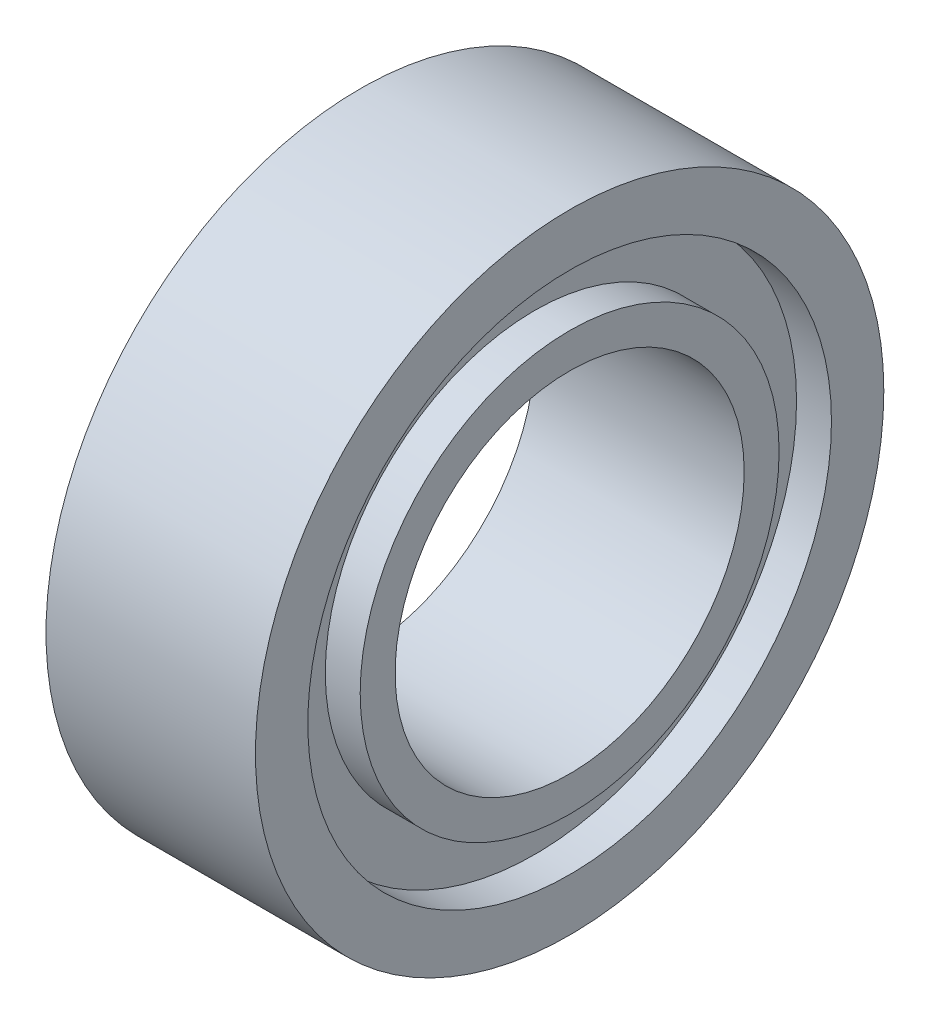
ISO-10303-21;
HEADER;
FILE_DESCRIPTION(('STEP AP214'),'2;1');
FILE_NAME('part.step','',(''),(''),'','','');
FILE_SCHEMA(('AUTOMOTIVE_DESIGN { 1 0 10303 214 1 1 1 1 }'));
ENDSEC;
DATA;
#1=APPLICATION_CONTEXT('core data for automotive mechanical design processes');
#2=APPLICATION_PROTOCOL_DEFINITION('international standard','automotive_design',2000,#1);
#3=PRODUCT_CONTEXT('',#1,'mechanical');
#4=PRODUCT('Part','Part','',(#3));
#5=PRODUCT_RELATED_PRODUCT_CATEGORY('part','',(#4));
#6=PRODUCT_DEFINITION_FORMATION('','',#4);
#7=PRODUCT_DEFINITION_CONTEXT('part definition',#1,'design');
#8=PRODUCT_DEFINITION('design','',#6,#7);
#9=PRODUCT_DEFINITION_SHAPE('','',#8);
#10=(LENGTH_UNIT() NAMED_UNIT(*) SI_UNIT(.MILLI.,.METRE.));
#11=(NAMED_UNIT(*) PLANE_ANGLE_UNIT() SI_UNIT($,.RADIAN.));
#12=(NAMED_UNIT(*) SI_UNIT($,.STERADIAN.) SOLID_ANGLE_UNIT());
#13=UNCERTAINTY_MEASURE_WITH_UNIT(LENGTH_MEASURE(1.E-05),#10,'distance_accuracy_value','');
#14=(GEOMETRIC_REPRESENTATION_CONTEXT(3) GLOBAL_UNCERTAINTY_ASSIGNED_CONTEXT((#13)) GLOBAL_UNIT_ASSIGNED_CONTEXT((#10,
#11,#12)) REPRESENTATION_CONTEXT('',''));
#15=CARTESIAN_POINT('',(0.,0.,0.));
#16=DIRECTION('',(0.,0.,1.));
#17=DIRECTION('',(1.,0.,0.));
#18=AXIS2_PLACEMENT_3D('',#15,#16,#17);
#19=CARTESIAN_POINT('',(1.5,0.,0.));
#20=DIRECTION('',(1.,0.,0.));
#21=DIRECTION('',(0.,0.,-1.));
#22=AXIS2_PLACEMENT_3D('',#19,#20,#21);
#23=PLANE('',#22);
#24=CARTESIAN_POINT('',(1.5,0.,0.));
#25=DIRECTION('',(1.,0.,0.));
#26=DIRECTION('',(0.,0.,-1.));
#27=AXIS2_PLACEMENT_3D('',#24,#25,#26);
#28=CIRCLE('',#27,2.5);
#29=CARTESIAN_POINT('',(1.5,0.,-2.5));
#30=VERTEX_POINT('',#29);
#31=EDGE_CURVE('E56',#30,#30,#28,.T.);
#32=ORIENTED_EDGE('',*,*,#31,.F.);
#33=EDGE_LOOP('',(#32));
#34=FACE_BOUND('',#33,.T.);
#35=CARTESIAN_POINT('',(1.5,0.,0.));
#36=DIRECTION('',(1.,0.,0.));
#37=DIRECTION('',(0.,0.,-1.));
#38=AXIS2_PLACEMENT_3D('',#35,#36,#37);
#39=CIRCLE('',#38,3.);
#40=CARTESIAN_POINT('',(1.5,0.,-3.));
#41=VERTEX_POINT('',#40);
#42=EDGE_CURVE('E74',#41,#41,#39,.T.);
#43=ORIENTED_EDGE('',*,*,#42,.T.);
#44=EDGE_LOOP('',(#43));
#45=FACE_BOUND('',#44,.T.);
#46=ADVANCED_FACE('F43',(#34,#45),#23,.T.);
#47=CARTESIAN_POINT('',(1.5,0.,0.));
#48=DIRECTION('',(1.,0.,0.));
#49=DIRECTION('',(0.,0.,-1.));
#50=AXIS2_PLACEMENT_3D('',#47,#48,#49);
#51=CIRCLE('',#50,3.75);
#52=CARTESIAN_POINT('',(1.5,0.,-3.75));
#53=VERTEX_POINT('',#52);
#54=EDGE_CURVE('E66',#53,#53,#51,.T.);
#55=ORIENTED_EDGE('',*,*,#54,.F.);
#56=EDGE_LOOP('',(#55));
#57=FACE_BOUND('',#56,.T.);
#58=CARTESIAN_POINT('',(1.5,0.,0.));
#59=DIRECTION('',(1.,0.,0.));
#60=DIRECTION('',(0.,0.,-1.));
#61=AXIS2_PLACEMENT_3D('',#58,#59,#60);
#62=CIRCLE('',#61,4.5);
#63=CARTESIAN_POINT('',(1.5,0.,-4.5));
#64=VERTEX_POINT('',#63);
#65=EDGE_CURVE('E10',#64,#64,#62,.T.);
#66=ORIENTED_EDGE('',*,*,#65,.T.);
#67=EDGE_LOOP('',(#66));
#68=FACE_BOUND('',#67,.T.);
#69=ADVANCED_FACE('F98',(#57,#68),#23,.T.);
#70=CARTESIAN_POINT('',(-1.5,0.,0.));
#71=DIRECTION('',(1.,0.,0.));
#72=DIRECTION('',(0.,0.,-1.));
#73=AXIS2_PLACEMENT_3D('',#70,#71,#72);
#74=PLANE('',#73);
#75=CARTESIAN_POINT('',(-1.5,0.,0.));
#76=DIRECTION('',(1.,0.,0.));
#77=DIRECTION('',(0.,0.,-1.));
#78=AXIS2_PLACEMENT_3D('',#75,#76,#77);
#79=CIRCLE('',#78,4.5);
#80=CARTESIAN_POINT('',(-1.5,0.,-4.5));
#81=VERTEX_POINT('',#80);
#82=EDGE_CURVE('E47',#81,#81,#79,.T.);
#83=ORIENTED_EDGE('',*,*,#82,.F.);
#84=EDGE_LOOP('',(#83));
#85=FACE_BOUND('',#84,.T.);
#86=CARTESIAN_POINT('',(-1.5,0.,0.));
#87=DIRECTION('',(1.,0.,0.));
#88=DIRECTION('',(0.,0.,-1.));
#89=AXIS2_PLACEMENT_3D('',#86,#87,#88);
#90=CIRCLE('',#89,2.5);
#91=CARTESIAN_POINT('',(-1.5,0.,-2.5));
#92=VERTEX_POINT('',#91);
#93=EDGE_CURVE('E58',#92,#92,#90,.T.);
#94=ORIENTED_EDGE('',*,*,#93,.T.);
#95=EDGE_LOOP('',(#94));
#96=FACE_BOUND('',#95,.T.);
#97=ADVANCED_FACE('F100',(#85,#96),#74,.F.);
#98=CARTESIAN_POINT('',(1.5,0.,0.));
#99=DIRECTION('',(-1.,0.,0.));
#100=DIRECTION('',(0.,0.,1.));
#101=AXIS2_PLACEMENT_3D('',#98,#99,#100);
#102=CYLINDRICAL_SURFACE('',#101,4.5);
#103=ORIENTED_EDGE('',*,*,#65,.F.);
#104=EDGE_LOOP('',(#103));
#105=FACE_BOUND('',#104,.T.);
#106=ORIENTED_EDGE('',*,*,#82,.T.);
#107=EDGE_LOOP('',(#106));
#108=FACE_BOUND('',#107,.T.);
#109=ADVANCED_FACE('F45',(#105,#108),#102,.T.);
#110=CARTESIAN_POINT('',(1.5,0.,0.));
#111=DIRECTION('',(-1.,0.,0.));
#112=DIRECTION('',(0.,0.,1.));
#113=AXIS2_PLACEMENT_3D('',#110,#111,#112);
#114=CYLINDRICAL_SURFACE('',#113,2.5);
#115=ORIENTED_EDGE('',*,*,#31,.T.);
#116=EDGE_LOOP('',(#115));
#117=FACE_BOUND('',#116,.T.);
#118=ORIENTED_EDGE('',*,*,#93,.F.);
#119=EDGE_LOOP('',(#118));
#120=FACE_BOUND('',#119,.T.);
#121=ADVANCED_FACE('F94',(#117,#120),#114,.F.);
#122=CARTESIAN_POINT('',(1.,0.,0.));
#123=DIRECTION('',(1.,0.,0.));
#124=DIRECTION('',(0.,0.,-1.));
#125=AXIS2_PLACEMENT_3D('',#122,#123,#124);
#126=CYLINDRICAL_SURFACE('',#125,3.75);
#127=CARTESIAN_POINT('',(1.,0.,0.));
#128=DIRECTION('',(1.,0.,0.));
#129=DIRECTION('',(0.,0.,-1.));
#130=AXIS2_PLACEMENT_3D('',#127,#128,#129);
#131=CIRCLE('',#130,3.75);
#132=CARTESIAN_POINT('',(1.,0.,-3.75));
#133=VERTEX_POINT('',#132);
#134=EDGE_CURVE('E62',#133,#133,#131,.T.);
#135=ORIENTED_EDGE('',*,*,#134,.F.);
#136=EDGE_LOOP('',(#135));
#137=FACE_BOUND('',#136,.T.);
#138=ORIENTED_EDGE('',*,*,#54,.T.);
#139=EDGE_LOOP('',(#138));
#140=FACE_BOUND('',#139,.T.);
#141=ADVANCED_FACE('F88',(#137,#140),#126,.F.);
#142=CARTESIAN_POINT('',(1.,0.,0.));
#143=DIRECTION('',(1.,0.,0.));
#144=DIRECTION('',(0.,0.,-1.));
#145=AXIS2_PLACEMENT_3D('',#142,#143,#144);
#146=PLANE('',#145);
#147=CARTESIAN_POINT('',(1.,0.,0.));
#148=DIRECTION('',(1.,0.,0.));
#149=DIRECTION('',(0.,0.,-1.));
#150=AXIS2_PLACEMENT_3D('',#147,#148,#149);
#151=CIRCLE('',#150,3.);
#152=CARTESIAN_POINT('',(1.,0.,-3.));
#153=VERTEX_POINT('',#152);
#154=EDGE_CURVE('E70',#153,#153,#151,.T.);
#155=ORIENTED_EDGE('',*,*,#154,.F.);
#156=EDGE_LOOP('',(#155));
#157=FACE_BOUND('',#156,.T.);
#158=ORIENTED_EDGE('',*,*,#134,.T.);
#159=EDGE_LOOP('',(#158));
#160=FACE_BOUND('',#159,.T.);
#161=ADVANCED_FACE('F85',(#157,#160),#146,.T.);
#162=CARTESIAN_POINT('',(1.,0.,0.));
#163=DIRECTION('',(1.,0.,0.));
#164=DIRECTION('',(0.,0.,-1.));
#165=AXIS2_PLACEMENT_3D('',#162,#163,#164);
#166=CYLINDRICAL_SURFACE('',#165,3.);
#167=ORIENTED_EDGE('',*,*,#154,.T.);
#168=EDGE_LOOP('',(#167));
#169=FACE_BOUND('',#168,.T.);
#170=ORIENTED_EDGE('',*,*,#42,.F.);
#171=EDGE_LOOP('',(#170));
#172=FACE_BOUND('',#171,.T.);
#173=ADVANCED_FACE('F82',(#169,#172),#166,.T.);
#174=CLOSED_SHELL('',(#46,#69,#97,#109,#121,#141,#161,#173));
#175=MANIFOLD_SOLID_BREP('B2',#174);
#176=ADVANCED_BREP_SHAPE_REPRESENTATION('',(#18,#175),#14);
#177=SHAPE_DEFINITION_REPRESENTATION(#9,#176);
ENDSEC;
END-ISO-10303-21;
